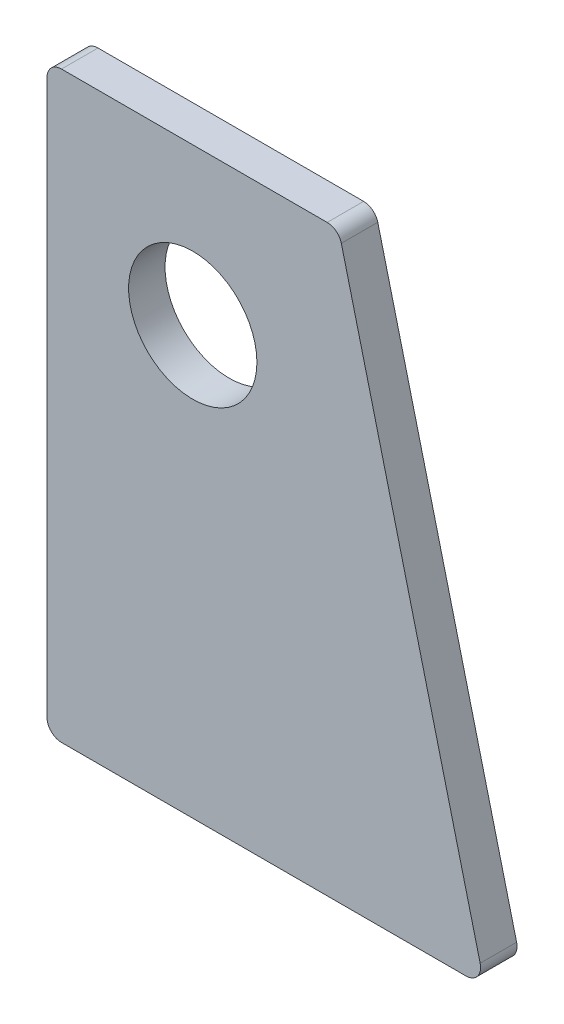
ISO-10303-21;
HEADER;
FILE_DESCRIPTION(('STEP AP214'),'2;1');
FILE_NAME('part.step','',(''),(''),'','','');
FILE_SCHEMA(('AUTOMOTIVE_DESIGN { 1 0 10303 214 1 1 1 1 }'));
ENDSEC;
DATA;
#1=APPLICATION_CONTEXT('core data for automotive mechanical design processes');
#2=APPLICATION_PROTOCOL_DEFINITION('international standard','automotive_design',2000,#1);
#3=PRODUCT_CONTEXT('',#1,'mechanical');
#4=PRODUCT('Part','Part','',(#3));
#5=PRODUCT_RELATED_PRODUCT_CATEGORY('part','',(#4));
#6=PRODUCT_DEFINITION_FORMATION('','',#4);
#7=PRODUCT_DEFINITION_CONTEXT('part definition',#1,'design');
#8=PRODUCT_DEFINITION('design','',#6,#7);
#9=PRODUCT_DEFINITION_SHAPE('','',#8);
#10=(LENGTH_UNIT() NAMED_UNIT(*) SI_UNIT(.MILLI.,.METRE.));
#11=(NAMED_UNIT(*) PLANE_ANGLE_UNIT() SI_UNIT($,.RADIAN.));
#12=(NAMED_UNIT(*) SI_UNIT($,.STERADIAN.) SOLID_ANGLE_UNIT());
#13=UNCERTAINTY_MEASURE_WITH_UNIT(LENGTH_MEASURE(1.E-05),#10,'distance_accuracy_value','');
#14=(GEOMETRIC_REPRESENTATION_CONTEXT(3) GLOBAL_UNCERTAINTY_ASSIGNED_CONTEXT((#13)) GLOBAL_UNIT_ASSIGNED_CONTEXT((#10,
#11,#12)) REPRESENTATION_CONTEXT('',''));
#15=CARTESIAN_POINT('',(0.,0.,0.));
#16=DIRECTION('',(0.,0.,1.));
#17=DIRECTION('',(1.,0.,0.));
#18=AXIS2_PLACEMENT_3D('',#15,#16,#17);
#19=CARTESIAN_POINT('',(0.,-101.6,6.35));
#20=DIRECTION('',(0.,1.,0.));
#21=DIRECTION('',(0.,0.,1.));
#22=AXIS2_PLACEMENT_3D('',#19,#20,#21);
#23=PLANE('',#22);
#24=DIRECTION('',(1.,0.,0.));
#25=VECTOR('',#24,1.);
#26=CARTESIAN_POINT('',(0.,-101.6,6.35));
#27=LINE('',#26,#25);
#28=CARTESIAN_POINT('',(2.54000000000001,-101.6,6.35));
#29=VERTEX_POINT('',#28);
#30=CARTESIAN_POINT('',(73.0013017456858,-101.6,6.35));
#31=VERTEX_POINT('',#30);
#32=EDGE_CURVE('E127',#29,#31,#27,.T.);
#33=ORIENTED_EDGE('',*,*,#32,.F.);
#34=DIRECTION('',(0.,0.,-1.));
#35=VECTOR('',#34,1.);
#36=CARTESIAN_POINT('',(2.54000000000001,-101.6,6.35));
#37=LINE('',#36,#35);
#38=CARTESIAN_POINT('',(2.54000000000001,-101.6,0.));
#39=VERTEX_POINT('',#38);
#40=EDGE_CURVE('E111',#29,#39,#37,.T.);
#41=ORIENTED_EDGE('',*,*,#40,.T.);
#42=DIRECTION('',(1.,0.,0.));
#43=VECTOR('',#42,1.);
#44=CARTESIAN_POINT('',(0.,-101.6,0.));
#45=LINE('',#44,#43);
#46=CARTESIAN_POINT('',(73.0013017456858,-101.6,0.));
#47=VERTEX_POINT('',#46);
#48=EDGE_CURVE('E124',#39,#47,#45,.T.);
#49=ORIENTED_EDGE('',*,*,#48,.T.);
#50=DIRECTION('',(0.,0.,-1.));
#51=VECTOR('',#50,1.);
#52=CARTESIAN_POINT('',(73.0013017456858,-101.6,6.35));
#53=LINE('',#52,#51);
#54=EDGE_CURVE('E130',#47,#31,#53,.F.);
#55=ORIENTED_EDGE('',*,*,#54,.T.);
#56=EDGE_LOOP('',(#33,#41,#49,#55));
#57=FACE_BOUND('',#56,.T.);
#58=ADVANCED_FACE('F41',(#57),#23,.F.);
#59=CARTESIAN_POINT('',(47.7993039444808,11.9762758319423,6.35));
#60=DIRECTION('',(-0.970016072036678,-0.243040778451961,0.));
#61=DIRECTION('',(0.243040778451961,-0.970016072036678,0.));
#62=AXIS2_PLACEMENT_3D('',#59,#60,#61);
#63=PLANE('',#62);
#64=DIRECTION('',(-0.243040778451961,0.970016072036678,0.));
#65=VECTOR('',#64,1.);
#66=CARTESIAN_POINT('',(47.7993039444808,11.9762758319423,6.35));
#67=LINE('',#66,#65);
#68=CARTESIAN_POINT('',(75.465142568659,-98.442676422732,6.35));
#69=VERTEX_POINT('',#68);
#70=CARTESIAN_POINT('',(51.2817330227435,-1.92267642273202,6.35));
#71=VERTEX_POINT('',#70);
#72=EDGE_CURVE('E202',#69,#71,#67,.T.);
#73=ORIENTED_EDGE('',*,*,#72,.F.);
#74=DIRECTION('',(0.,0.,-1.));
#75=VECTOR('',#74,1.);
#76=CARTESIAN_POINT('',(75.465142568659,-98.442676422732,6.35));
#77=LINE('',#76,#75);
#78=CARTESIAN_POINT('',(75.465142568659,-98.442676422732,0.));
#79=VERTEX_POINT('',#78);
#80=EDGE_CURVE('E183',#69,#79,#77,.T.);
#81=ORIENTED_EDGE('',*,*,#80,.T.);
#82=DIRECTION('',(-0.243040778451961,0.970016072036678,0.));
#83=VECTOR('',#82,1.);
#84=CARTESIAN_POINT('',(47.7993039444808,11.9762758319423,0.));
#85=LINE('',#84,#83);
#86=CARTESIAN_POINT('',(51.2817330227435,-1.92267642273202,0.));
#87=VERTEX_POINT('',#86);
#88=EDGE_CURVE('E135',#79,#87,#85,.T.);
#89=ORIENTED_EDGE('',*,*,#88,.T.);
#90=DIRECTION('',(0.,0.,-1.));
#91=VECTOR('',#90,1.);
#92=CARTESIAN_POINT('',(51.2817330227435,-1.92267642273202,6.35));
#93=LINE('',#92,#91);
#94=EDGE_CURVE('E180',#87,#71,#93,.F.);
#95=ORIENTED_EDGE('',*,*,#94,.T.);
#96=EDGE_LOOP('',(#73,#81,#89,#95));
#97=FACE_BOUND('',#96,.T.);
#98=ADVANCED_FACE('F227',(#97),#63,.F.);
#99=CARTESIAN_POINT('',(0.,0.,6.35));
#100=DIRECTION('',(0.,1.,0.));
#101=DIRECTION('',(0.,0.,1.));
#102=AXIS2_PLACEMENT_3D('',#99,#100,#101);
#103=PLANE('',#102);
#104=DIRECTION('',(1.,0.,0.));
#105=VECTOR('',#104,1.);
#106=CARTESIAN_POINT('',(0.,0.,0.));
#107=LINE('',#106,#105);
#108=CARTESIAN_POINT('',(2.54,0.,0.));
#109=VERTEX_POINT('',#108);
#110=CARTESIAN_POINT('',(48.8178921997703,0.,0.));
#111=VERTEX_POINT('',#110);
#112=EDGE_CURVE('E141',#109,#111,#107,.T.);
#113=ORIENTED_EDGE('',*,*,#112,.F.);
#114=DIRECTION('',(0.,0.,-1.));
#115=VECTOR('',#114,1.);
#116=CARTESIAN_POINT('',(2.54,0.,6.35));
#117=LINE('',#116,#115);
#118=CARTESIAN_POINT('',(2.54,0.,6.35));
#119=VERTEX_POINT('',#118);
#120=EDGE_CURVE('E11',#109,#119,#117,.F.);
#121=ORIENTED_EDGE('',*,*,#120,.T.);
#122=DIRECTION('',(1.,0.,0.));
#123=VECTOR('',#122,1.);
#124=CARTESIAN_POINT('',(0.,0.,6.35));
#125=LINE('',#124,#123);
#126=CARTESIAN_POINT('',(48.8178921997703,0.,6.35));
#127=VERTEX_POINT('',#126);
#128=EDGE_CURVE('E190',#119,#127,#125,.T.);
#129=ORIENTED_EDGE('',*,*,#128,.T.);
#130=DIRECTION('',(0.,0.,-1.));
#131=VECTOR('',#130,1.);
#132=CARTESIAN_POINT('',(48.8178921997703,0.,0.));
#133=LINE('',#132,#131);
#134=EDGE_CURVE('E50',#127,#111,#133,.T.);
#135=ORIENTED_EDGE('',*,*,#134,.T.);
#136=EDGE_LOOP('',(#113,#121,#129,#135));
#137=FACE_BOUND('',#136,.T.);
#138=ADVANCED_FACE('F189',(#137),#103,.T.);
#139=CARTESIAN_POINT('',(25.4,-27.2197046535212,6.35));
#140=DIRECTION('',(0.,0.,-1.));
#141=DIRECTION('',(-1.,0.,0.));
#142=AXIS2_PLACEMENT_3D('',#139,#140,#141);
#143=CYLINDRICAL_SURFACE('',#142,11.176);
#144=CARTESIAN_POINT('',(25.4,-27.2197046535212,6.35));
#145=DIRECTION('',(0.,0.,1.));
#146=DIRECTION('',(1.,0.,0.));
#147=AXIS2_PLACEMENT_3D('',#144,#145,#146);
#148=CIRCLE('',#147,11.176);
#149=CARTESIAN_POINT('',(36.576,-27.2197046535212,6.35));
#150=VERTEX_POINT('',#149);
#151=EDGE_CURVE('E153',#150,#150,#148,.T.);
#152=ORIENTED_EDGE('',*,*,#151,.T.);
#153=EDGE_LOOP('',(#152));
#154=FACE_BOUND('',#153,.T.);
#155=CARTESIAN_POINT('',(25.4,-27.2197046535212,0.));
#156=DIRECTION('',(0.,0.,1.));
#157=DIRECTION('',(1.,0.,0.));
#158=AXIS2_PLACEMENT_3D('',#155,#156,#157);
#159=CIRCLE('',#158,11.176);
#160=CARTESIAN_POINT('',(36.576,-27.2197046535212,0.));
#161=VERTEX_POINT('',#160);
#162=EDGE_CURVE('E136',#161,#161,#159,.T.);
#163=ORIENTED_EDGE('',*,*,#162,.F.);
#164=EDGE_LOOP('',(#163));
#165=FACE_BOUND('',#164,.T.);
#166=ADVANCED_FACE('F213',(#154,#165),#143,.F.);
#167=CARTESIAN_POINT('',(0.,0.,6.35));
#168=DIRECTION('',(1.,0.,0.));
#169=DIRECTION('',(0.,1.,0.));
#170=AXIS2_PLACEMENT_3D('',#167,#168,#169);
#171=PLANE('',#170);
#172=DIRECTION('',(0.,-1.,0.));
#173=VECTOR('',#172,1.);
#174=CARTESIAN_POINT('',(0.,0.,0.));
#175=LINE('',#174,#173);
#176=CARTESIAN_POINT('',(0.,-2.54,0.));
#177=VERTEX_POINT('',#176);
#178=CARTESIAN_POINT('',(0.,-99.06,0.));
#179=VERTEX_POINT('',#178);
#180=EDGE_CURVE('E150',#177,#179,#175,.T.);
#181=ORIENTED_EDGE('',*,*,#180,.T.);
#182=DIRECTION('',(0.,0.,-1.));
#183=VECTOR('',#182,1.);
#184=CARTESIAN_POINT('',(0.,-99.06,6.35));
#185=LINE('',#184,#183);
#186=CARTESIAN_POINT('',(0.,-99.06,6.35));
#187=VERTEX_POINT('',#186);
#188=EDGE_CURVE('E112',#179,#187,#185,.F.);
#189=ORIENTED_EDGE('',*,*,#188,.T.);
#190=DIRECTION('',(0.,-1.,0.));
#191=VECTOR('',#190,1.);
#192=CARTESIAN_POINT('',(0.,0.,6.35));
#193=LINE('',#192,#191);
#194=CARTESIAN_POINT('',(0.,-2.54,6.35));
#195=VERTEX_POINT('',#194);
#196=EDGE_CURVE('E155',#195,#187,#193,.T.);
#197=ORIENTED_EDGE('',*,*,#196,.F.);
#198=DIRECTION('',(0.,0.,-1.));
#199=VECTOR('',#198,1.);
#200=CARTESIAN_POINT('',(0.,-2.54,0.));
#201=LINE('',#200,#199);
#202=EDGE_CURVE('E118',#195,#177,#201,.T.);
#203=ORIENTED_EDGE('',*,*,#202,.T.);
#204=EDGE_LOOP('',(#181,#189,#197,#203));
#205=FACE_BOUND('',#204,.T.);
#206=ADVANCED_FACE('F198',(#205),#171,.F.);
#207=CARTESIAN_POINT('',(0.,0.,6.35));
#208=DIRECTION('',(0.,0.,1.));
#209=DIRECTION('',(1.,0.,0.));
#210=AXIS2_PLACEMENT_3D('',#207,#208,#209);
#211=PLANE('',#210);
#212=ORIENTED_EDGE('',*,*,#151,.F.);
#213=EDGE_LOOP('',(#212));
#214=FACE_BOUND('',#213,.T.);
#215=ORIENTED_EDGE('',*,*,#196,.T.);
#216=CARTESIAN_POINT('',(2.54000000000001,-99.06,6.35));
#217=DIRECTION('',(0.,0.,1.));
#218=DIRECTION('',(1.,0.,0.));
#219=AXIS2_PLACEMENT_3D('',#216,#217,#218);
#220=CIRCLE('',#219,2.54);
#221=EDGE_CURVE('E177',#187,#29,#220,.T.);
#222=ORIENTED_EDGE('',*,*,#221,.T.);
#223=ORIENTED_EDGE('',*,*,#32,.T.);
#224=CARTESIAN_POINT('',(73.0013017456858,-99.06,6.35));
#225=DIRECTION('',(0.,0.,1.));
#226=DIRECTION('',(1.,0.,0.));
#227=AXIS2_PLACEMENT_3D('',#224,#225,#226);
#228=CIRCLE('',#227,2.54);
#229=EDGE_CURVE('E174',#31,#69,#228,.T.);
#230=ORIENTED_EDGE('',*,*,#229,.T.);
#231=ORIENTED_EDGE('',*,*,#72,.T.);
#232=CARTESIAN_POINT('',(48.8178921997703,-2.54,6.35));
#233=DIRECTION('',(0.,0.,1.));
#234=DIRECTION('',(1.,0.,0.));
#235=AXIS2_PLACEMENT_3D('',#232,#233,#234);
#236=CIRCLE('',#235,2.54);
#237=EDGE_CURVE('E57',#71,#127,#236,.T.);
#238=ORIENTED_EDGE('',*,*,#237,.T.);
#239=ORIENTED_EDGE('',*,*,#128,.F.);
#240=CARTESIAN_POINT('',(2.54,-2.54,6.35));
#241=DIRECTION('',(0.,0.,1.));
#242=DIRECTION('',(1.,0.,0.));
#243=AXIS2_PLACEMENT_3D('',#240,#241,#242);
#244=CIRCLE('',#243,2.54);
#245=EDGE_CURVE('E171',#119,#195,#244,.T.);
#246=ORIENTED_EDGE('',*,*,#245,.T.);
#247=EDGE_LOOP('',(#215,#222,#223,#230,#231,#238,#239,#246));
#248=FACE_BOUND('',#247,.T.);
#249=ADVANCED_FACE('F216',(#214,#248),#211,.T.);
#250=CARTESIAN_POINT('',(0.,0.,0.));
#251=DIRECTION('',(0.,0.,1.));
#252=DIRECTION('',(1.,0.,0.));
#253=AXIS2_PLACEMENT_3D('',#250,#251,#252);
#254=PLANE('',#253);
#255=ORIENTED_EDGE('',*,*,#162,.T.);
#256=EDGE_LOOP('',(#255));
#257=FACE_BOUND('',#256,.T.);
#258=ORIENTED_EDGE('',*,*,#48,.F.);
#259=CARTESIAN_POINT('',(2.54000000000001,-99.06,0.));
#260=DIRECTION('',(0.,0.,1.));
#261=DIRECTION('',(1.,0.,0.));
#262=AXIS2_PLACEMENT_3D('',#259,#260,#261);
#263=CIRCLE('',#262,2.54);
#264=EDGE_CURVE('E107',#39,#179,#263,.F.);
#265=ORIENTED_EDGE('',*,*,#264,.T.);
#266=ORIENTED_EDGE('',*,*,#180,.F.);
#267=CARTESIAN_POINT('',(2.54,-2.54,0.));
#268=DIRECTION('',(0.,0.,1.));
#269=DIRECTION('',(1.,0.,0.));
#270=AXIS2_PLACEMENT_3D('',#267,#268,#269);
#271=CIRCLE('',#270,2.54);
#272=EDGE_CURVE('E159',#177,#109,#271,.F.);
#273=ORIENTED_EDGE('',*,*,#272,.T.);
#274=ORIENTED_EDGE('',*,*,#112,.T.);
#275=CARTESIAN_POINT('',(48.8178921997703,-2.54,0.));
#276=DIRECTION('',(0.,0.,1.));
#277=DIRECTION('',(1.,0.,0.));
#278=AXIS2_PLACEMENT_3D('',#275,#276,#277);
#279=CIRCLE('',#278,2.54);
#280=EDGE_CURVE('E129',#111,#87,#279,.F.);
#281=ORIENTED_EDGE('',*,*,#280,.T.);
#282=ORIENTED_EDGE('',*,*,#88,.F.);
#283=CARTESIAN_POINT('',(73.0013017456858,-99.06,0.));
#284=DIRECTION('',(0.,0.,1.));
#285=DIRECTION('',(1.,0.,0.));
#286=AXIS2_PLACEMENT_3D('',#283,#284,#285);
#287=CIRCLE('',#286,2.54);
#288=EDGE_CURVE('E119',#79,#47,#287,.F.);
#289=ORIENTED_EDGE('',*,*,#288,.T.);
#290=EDGE_LOOP('',(#258,#265,#266,#273,#274,#281,#282,#289));
#291=FACE_BOUND('',#290,.T.);
#292=ADVANCED_FACE('F132',(#257,#291),#254,.F.);
#293=CARTESIAN_POINT('',(2.54000000000001,-99.06,6.35));
#294=DIRECTION('',(0.,0.,-1.));
#295=DIRECTION('',(-1.,0.,0.));
#296=AXIS2_PLACEMENT_3D('',#293,#294,#295);
#297=CYLINDRICAL_SURFACE('',#296,2.54);
#298=ORIENTED_EDGE('',*,*,#221,.F.);
#299=ORIENTED_EDGE('',*,*,#188,.F.);
#300=ORIENTED_EDGE('',*,*,#264,.F.);
#301=ORIENTED_EDGE('',*,*,#40,.F.);
#302=EDGE_LOOP('',(#298,#299,#300,#301));
#303=FACE_BOUND('',#302,.T.);
#304=ADVANCED_FACE('F110',(#303),#297,.T.);
#305=CARTESIAN_POINT('',(73.0013017456858,-99.06,6.35));
#306=DIRECTION('',(0.,0.,-1.));
#307=DIRECTION('',(-1.,0.,0.));
#308=AXIS2_PLACEMENT_3D('',#305,#306,#307);
#309=CYLINDRICAL_SURFACE('',#308,2.54);
#310=ORIENTED_EDGE('',*,*,#229,.F.);
#311=ORIENTED_EDGE('',*,*,#54,.F.);
#312=ORIENTED_EDGE('',*,*,#288,.F.);
#313=ORIENTED_EDGE('',*,*,#80,.F.);
#314=EDGE_LOOP('',(#310,#311,#312,#313));
#315=FACE_BOUND('',#314,.T.);
#316=ADVANCED_FACE('F240',(#315),#309,.T.);
#317=CARTESIAN_POINT('',(2.54,-2.54,6.35));
#318=DIRECTION('',(0.,0.,1.));
#319=DIRECTION('',(1.,0.,0.));
#320=AXIS2_PLACEMENT_3D('',#317,#318,#319);
#321=CYLINDRICAL_SURFACE('',#320,2.54);
#322=ORIENTED_EDGE('',*,*,#245,.F.);
#323=ORIENTED_EDGE('',*,*,#120,.F.);
#324=ORIENTED_EDGE('',*,*,#272,.F.);
#325=ORIENTED_EDGE('',*,*,#202,.F.);
#326=EDGE_LOOP('',(#322,#323,#324,#325));
#327=FACE_BOUND('',#326,.T.);
#328=ADVANCED_FACE('F195',(#327),#321,.T.);
#329=CARTESIAN_POINT('',(48.8178921997703,-2.54,6.35));
#330=DIRECTION('',(0.,0.,1.));
#331=DIRECTION('',(1.,0.,0.));
#332=AXIS2_PLACEMENT_3D('',#329,#330,#331);
#333=CYLINDRICAL_SURFACE('',#332,2.54);
#334=ORIENTED_EDGE('',*,*,#237,.F.);
#335=ORIENTED_EDGE('',*,*,#94,.F.);
#336=ORIENTED_EDGE('',*,*,#280,.F.);
#337=ORIENTED_EDGE('',*,*,#134,.F.);
#338=EDGE_LOOP('',(#334,#335,#336,#337));
#339=FACE_BOUND('',#338,.T.);
#340=ADVANCED_FACE('F43',(#339),#333,.T.);
#341=CLOSED_SHELL('',(#58,#98,#138,#166,#206,#249,#292,#304,#316,#328,#340));
#342=MANIFOLD_SOLID_BREP('B2',#341);
#343=ADVANCED_BREP_SHAPE_REPRESENTATION('',(#18,#342),#14);
#344=SHAPE_DEFINITION_REPRESENTATION(#9,#343);
ENDSEC;
END-ISO-10303-21;
